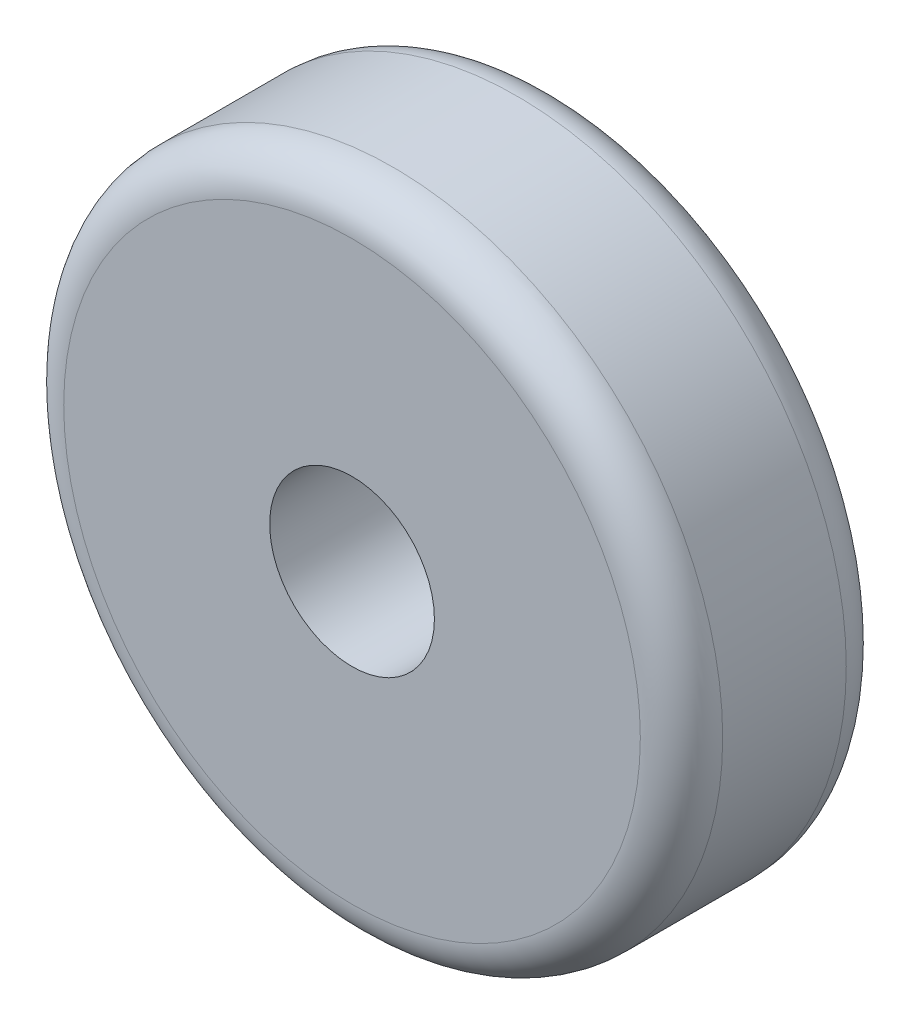
ISO-10303-21;
HEADER;
FILE_DESCRIPTION(('STEP AP214'),'2;1');
FILE_NAME('part.step','',(''),(''),'','','');
FILE_SCHEMA(('AUTOMOTIVE_DESIGN { 1 0 10303 214 1 1 1 1 }'));
ENDSEC;
DATA;
#1=APPLICATION_CONTEXT('core data for automotive mechanical design processes');
#2=APPLICATION_PROTOCOL_DEFINITION('international standard','automotive_design',2000,#1);
#3=PRODUCT_CONTEXT('',#1,'mechanical');
#4=PRODUCT('Part','Part','',(#3));
#5=PRODUCT_RELATED_PRODUCT_CATEGORY('part','',(#4));
#6=PRODUCT_DEFINITION_FORMATION('','',#4);
#7=PRODUCT_DEFINITION_CONTEXT('part definition',#1,'design');
#8=PRODUCT_DEFINITION('design','',#6,#7);
#9=PRODUCT_DEFINITION_SHAPE('','',#8);
#10=(LENGTH_UNIT() NAMED_UNIT(*) SI_UNIT(.MILLI.,.METRE.));
#11=(NAMED_UNIT(*) PLANE_ANGLE_UNIT() SI_UNIT($,.RADIAN.));
#12=(NAMED_UNIT(*) SI_UNIT($,.STERADIAN.) SOLID_ANGLE_UNIT());
#13=UNCERTAINTY_MEASURE_WITH_UNIT(LENGTH_MEASURE(1.E-05),#10,'distance_accuracy_value','');
#14=(GEOMETRIC_REPRESENTATION_CONTEXT(3) GLOBAL_UNCERTAINTY_ASSIGNED_CONTEXT((#13)) GLOBAL_UNIT_ASSIGNED_CONTEXT((#10,
#11,#12)) REPRESENTATION_CONTEXT('',''));
#15=CARTESIAN_POINT('',(0.,0.,0.));
#16=DIRECTION('',(0.,0.,1.));
#17=DIRECTION('',(1.,0.,0.));
#18=AXIS2_PLACEMENT_3D('',#15,#16,#17);
#19=CARTESIAN_POINT('',(0.,0.,5.));
#20=DIRECTION('',(0.,0.,1.));
#21=DIRECTION('',(1.,0.,0.));
#22=AXIS2_PLACEMENT_3D('',#19,#20,#21);
#23=PLANE('',#22);
#24=CARTESIAN_POINT('',(0.,0.,5.));
#25=DIRECTION('',(0.,0.,1.));
#26=DIRECTION('',(1.,0.,0.));
#27=AXIS2_PLACEMENT_3D('',#24,#25,#26);
#28=CIRCLE('',#27,7.);
#29=CARTESIAN_POINT('',(7.,0.,5.));
#30=VERTEX_POINT('',#29);
#31=EDGE_CURVE('E10',#30,#30,#28,.T.);
#32=ORIENTED_EDGE('',*,*,#31,.T.);
#33=EDGE_LOOP('',(#32));
#34=FACE_BOUND('',#33,.T.);
#35=CARTESIAN_POINT('',(0.,0.,5.));
#36=DIRECTION('',(0.,0.,1.));
#37=DIRECTION('',(1.,0.,0.));
#38=AXIS2_PLACEMENT_3D('',#35,#36,#37);
#39=CIRCLE('',#38,2.);
#40=CARTESIAN_POINT('',(2.,0.,5.));
#41=VERTEX_POINT('',#40);
#42=EDGE_CURVE('E57',#41,#41,#39,.T.);
#43=ORIENTED_EDGE('',*,*,#42,.F.);
#44=EDGE_LOOP('',(#43));
#45=FACE_BOUND('',#44,.T.);
#46=ADVANCED_FACE('F37',(#34,#45),#23,.T.);
#47=CARTESIAN_POINT('',(0.,0.,0.));
#48=DIRECTION('',(0.,0.,1.));
#49=DIRECTION('',(1.,0.,0.));
#50=AXIS2_PLACEMENT_3D('',#47,#48,#49);
#51=PLANE('',#50);
#52=CARTESIAN_POINT('',(0.,0.,0.));
#53=DIRECTION('',(0.,0.,1.));
#54=DIRECTION('',(1.,0.,0.));
#55=AXIS2_PLACEMENT_3D('',#52,#53,#54);
#56=CIRCLE('',#55,7.);
#57=CARTESIAN_POINT('',(7.,0.,0.));
#58=VERTEX_POINT('',#57);
#59=EDGE_CURVE('E44',#58,#58,#56,.F.);
#60=ORIENTED_EDGE('',*,*,#59,.T.);
#61=EDGE_LOOP('',(#60));
#62=FACE_BOUND('',#61,.T.);
#63=CARTESIAN_POINT('',(0.,0.,0.));
#64=DIRECTION('',(0.,0.,1.));
#65=DIRECTION('',(1.,0.,0.));
#66=AXIS2_PLACEMENT_3D('',#63,#64,#65);
#67=CIRCLE('',#66,2.);
#68=CARTESIAN_POINT('',(2.,0.,0.));
#69=VERTEX_POINT('',#68);
#70=EDGE_CURVE('E58',#69,#69,#67,.T.);
#71=ORIENTED_EDGE('',*,*,#70,.T.);
#72=EDGE_LOOP('',(#71));
#73=FACE_BOUND('',#72,.T.);
#74=ADVANCED_FACE('F68',(#62,#73),#51,.F.);
#75=CARTESIAN_POINT('',(0.,0.,5.));
#76=DIRECTION('',(0.,0.,-1.));
#77=DIRECTION('',(-1.,0.,0.));
#78=AXIS2_PLACEMENT_3D('',#75,#76,#77);
#79=CYLINDRICAL_SURFACE('',#78,8.);
#80=CARTESIAN_POINT('',(0.,0.,1.));
#81=DIRECTION('',(0.,0.,1.));
#82=DIRECTION('',(1.,0.,0.));
#83=AXIS2_PLACEMENT_3D('',#80,#81,#82);
#84=CIRCLE('',#83,8.);
#85=CARTESIAN_POINT('',(8.,0.,1.));
#86=VERTEX_POINT('',#85);
#87=EDGE_CURVE('E48',#86,#86,#84,.T.);
#88=ORIENTED_EDGE('',*,*,#87,.T.);
#89=EDGE_LOOP('',(#88));
#90=FACE_BOUND('',#89,.T.);
#91=CARTESIAN_POINT('',(0.,0.,4.));
#92=DIRECTION('',(0.,0.,1.));
#93=DIRECTION('',(1.,0.,0.));
#94=AXIS2_PLACEMENT_3D('',#91,#92,#93);
#95=CIRCLE('',#94,8.);
#96=CARTESIAN_POINT('',(8.,0.,4.));
#97=VERTEX_POINT('',#96);
#98=EDGE_CURVE('E52',#97,#97,#95,.F.);
#99=ORIENTED_EDGE('',*,*,#98,.T.);
#100=EDGE_LOOP('',(#99));
#101=FACE_BOUND('',#100,.T.);
#102=ADVANCED_FACE('F73',(#90,#101),#79,.T.);
#103=CARTESIAN_POINT('',(0.,0.,5.));
#104=DIRECTION('',(0.,0.,-1.));
#105=DIRECTION('',(-1.,0.,0.));
#106=AXIS2_PLACEMENT_3D('',#103,#104,#105);
#107=CYLINDRICAL_SURFACE('',#106,2.);
#108=ORIENTED_EDGE('',*,*,#42,.T.);
#109=EDGE_LOOP('',(#108));
#110=FACE_BOUND('',#109,.T.);
#111=ORIENTED_EDGE('',*,*,#70,.F.);
#112=EDGE_LOOP('',(#111));
#113=FACE_BOUND('',#112,.T.);
#114=ADVANCED_FACE('F64',(#110,#113),#107,.F.);
#115=CARTESIAN_POINT('',(0.,0.,1.));
#116=DIRECTION('',(0.,0.,1.));
#117=DIRECTION('',(1.,0.,0.));
#118=AXIS2_PLACEMENT_3D('',#115,#116,#117);
#119=TOROIDAL_SURFACE('',#118,7.,1.);
#120=ORIENTED_EDGE('',*,*,#59,.F.);
#121=EDGE_LOOP('',(#120));
#122=FACE_BOUND('',#121,.T.);
#123=ORIENTED_EDGE('',*,*,#87,.F.);
#124=EDGE_LOOP('',(#123));
#125=FACE_BOUND('',#124,.T.);
#126=ADVANCED_FACE('F79',(#122,#125),#119,.T.);
#127=CARTESIAN_POINT('',(0.,0.,4.));
#128=DIRECTION('',(0.,0.,1.));
#129=DIRECTION('',(1.,0.,0.));
#130=AXIS2_PLACEMENT_3D('',#127,#128,#129);
#131=TOROIDAL_SURFACE('',#130,7.,1.);
#132=ORIENTED_EDGE('',*,*,#98,.F.);
#133=EDGE_LOOP('',(#132));
#134=FACE_BOUND('',#133,.T.);
#135=ORIENTED_EDGE('',*,*,#31,.F.);
#136=EDGE_LOOP('',(#135));
#137=FACE_BOUND('',#136,.T.);
#138=ADVANCED_FACE('F39',(#134,#137),#131,.T.);
#139=CLOSED_SHELL('',(#46,#74,#102,#114,#126,#138));
#140=MANIFOLD_SOLID_BREP('B2',#139);
#141=ADVANCED_BREP_SHAPE_REPRESENTATION('',(#18,#140),#14);
#142=SHAPE_DEFINITION_REPRESENTATION(#9,#141);
ENDSEC;
END-ISO-10303-21;
